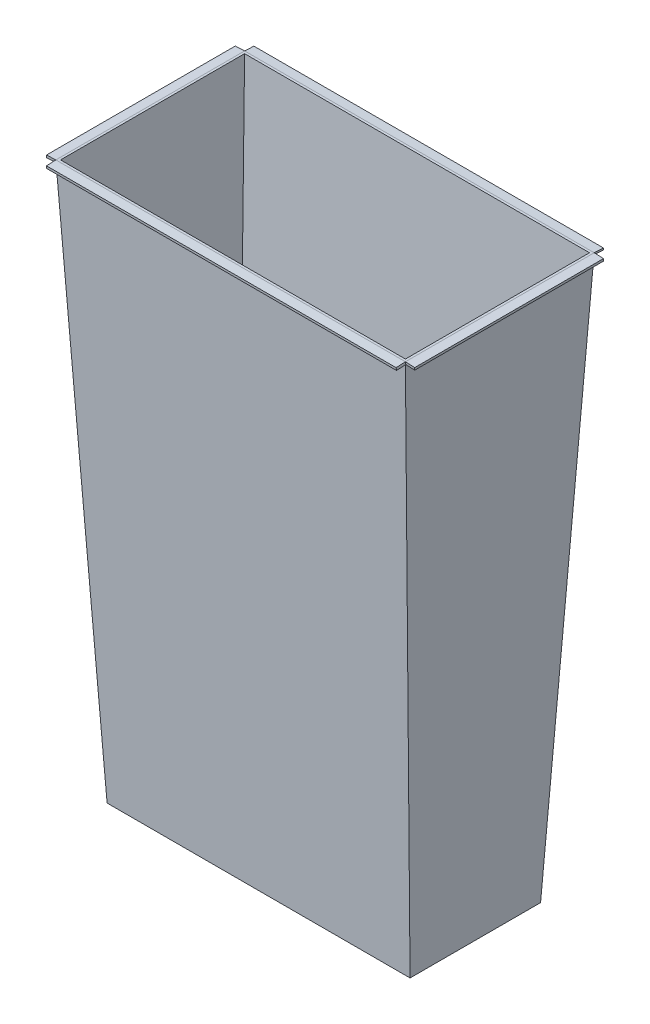
ISO-10303-21;
HEADER;
FILE_DESCRIPTION(('STEP AP214'),'2;1');
FILE_NAME('part.step','',(''),(''),'','','');
FILE_SCHEMA(('AUTOMOTIVE_DESIGN { 1 0 10303 214 1 1 1 1 }'));
ENDSEC;
DATA;
#1=APPLICATION_CONTEXT('core data for automotive mechanical design processes');
#2=APPLICATION_PROTOCOL_DEFINITION('international standard','automotive_design',2000,#1);
#3=PRODUCT_CONTEXT('',#1,'mechanical');
#4=PRODUCT('Part','Part','',(#3));
#5=PRODUCT_RELATED_PRODUCT_CATEGORY('part','',(#4));
#6=PRODUCT_DEFINITION_FORMATION('','',#4);
#7=PRODUCT_DEFINITION_CONTEXT('part definition',#1,'design');
#8=PRODUCT_DEFINITION('design','',#6,#7);
#9=PRODUCT_DEFINITION_SHAPE('','',#8);
#10=(LENGTH_UNIT() NAMED_UNIT(*) SI_UNIT(.MILLI.,.METRE.));
#11=(NAMED_UNIT(*) PLANE_ANGLE_UNIT() SI_UNIT($,.RADIAN.));
#12=(NAMED_UNIT(*) SI_UNIT($,.STERADIAN.) SOLID_ANGLE_UNIT());
#13=UNCERTAINTY_MEASURE_WITH_UNIT(LENGTH_MEASURE(1.E-05),#10,'distance_accuracy_value','');
#14=(GEOMETRIC_REPRESENTATION_CONTEXT(3) GLOBAL_UNCERTAINTY_ASSIGNED_CONTEXT((#13)) GLOBAL_UNIT_ASSIGNED_CONTEXT((#10,
#11,#12)) REPRESENTATION_CONTEXT('',''));
#15=CARTESIAN_POINT('',(0.,0.,0.));
#16=DIRECTION('',(0.,0.,1.));
#17=DIRECTION('',(1.,0.,0.));
#18=AXIS2_PLACEMENT_3D('',#15,#16,#17);
#19=CARTESIAN_POINT('',(0.,0.633416458852866,-12.6683291770573));
#20=DIRECTION('',(0.,-0.0499376169438923,0.998752338877845));
#21=DIRECTION('',(0.,-0.998752338877845,-0.0499376169438923));
#22=AXIS2_PLACEMENT_3D('',#19,#20,#21);
#23=PLANE('',#22);
#24=DIRECTION('',(-0.0415786937506803,-0.997888650016328,-0.0498944325008165));
#25=VECTOR('',#24,1.);
#26=CARTESIAN_POINT('',(488.95,0.,-12.6999999999999));
#27=LINE('',#26,#25);
#28=CARTESIAN_POINT('',(488.817873388503,-3.17103867593733,-12.8585519337968));
#29=VERTEX_POINT('',#28);
#30=CARTESIAN_POINT('',(488.817823020539,-3.17224750706824,-12.8586123753534));
#31=VERTEX_POINT('',#30);
#32=EDGE_CURVE('E477',#29,#31,#27,.T.);
#33=ORIENTED_EDGE('',*,*,#32,.F.);
#34=DIRECTION('',(1.,0.,0.));
#35=VECTOR('',#34,1.);
#36=CARTESIAN_POINT('',(489.354419625125,-3.17103867593704,-12.8585519337968));
#37=LINE('',#36,#35);
#38=CARTESIAN_POINT('',(12.8321266114974,-3.1710386759371,-12.8585519337968));
#39=VERTEX_POINT('',#38);
#40=EDGE_CURVE('E60',#39,#29,#37,.T.);
#41=ORIENTED_EDGE('',*,*,#40,.F.);
#42=DIRECTION('',(0.0415786937506803,-0.997888650016328,-0.0498944325008165));
#43=VECTOR('',#42,1.);
#44=CARTESIAN_POINT('',(12.7,0.,-12.6999999999999));
#45=LINE('',#44,#43);
#46=CARTESIAN_POINT('',(12.8321769794612,-3.17224750706822,-12.8586123753534));
#47=VERTEX_POINT('',#46);
#48=EDGE_CURVE('E481',#39,#47,#45,.T.);
#49=ORIENTED_EDGE('',*,*,#48,.T.);
#50=CARTESIAN_POINT('',(44.45,-762.,-50.8));
#51=VERTEX_POINT('',#50);
#52=EDGE_CURVE('E350',#47,#51,#45,.T.);
#53=ORIENTED_EDGE('',*,*,#52,.T.);
#54=DIRECTION('',(1.,0.,0.));
#55=VECTOR('',#54,1.);
#56=CARTESIAN_POINT('',(44.45,-762.,-50.8));
#57=LINE('',#56,#55);
#58=CARTESIAN_POINT('',(457.2,-762.,-50.8));
#59=VERTEX_POINT('',#58);
#60=EDGE_CURVE('E329',#51,#59,#57,.T.);
#61=ORIENTED_EDGE('',*,*,#60,.T.);
#62=EDGE_CURVE('E381',#31,#59,#27,.T.);
#63=ORIENTED_EDGE('',*,*,#62,.F.);
#64=EDGE_LOOP('',(#33,#41,#49,#53,#61,#63));
#65=FACE_BOUND('',#64,.T.);
#66=ADVANCED_FACE('F42',(#65),#23,.T.);
#67=CARTESIAN_POINT('',(12.6779896013865,0.528249566724436,0.));
#68=DIRECTION('',(0.999133073092352,0.0416305447121812,0.));
#69=DIRECTION('',(-0.0416305447121812,0.999133073092352,0.));
#70=AXIS2_PLACEMENT_3D('',#67,#68,#69);
#71=PLANE('',#70);
#72=ORIENTED_EDGE('',*,*,#48,.F.);
#73=DIRECTION('',(0.00208072953512228,-0.049937508842932,0.99875017685864));
#74=VECTOR('',#73,1.);
#75=CARTESIAN_POINT('',(12.8584632938224,-3.80311905173782,-0.216944417782356));
#76=LINE('',#75,#74);
#77=CARTESIAN_POINT('',(12.8321517954793,-3.1722485564008,-12.8343543245228));
#78=VERTEX_POINT('',#77);
#79=EDGE_CURVE('E216',#39,#78,#76,.T.);
#80=ORIENTED_EDGE('',*,*,#79,.T.);
#81=DIRECTION('',(0.,0.,1.));
#82=VECTOR('',#81,1.);
#83=CARTESIAN_POINT('',(12.8321769794612,-3.17224750706822,-12.6999999999999));
#84=LINE('',#83,#82);
#85=EDGE_CURVE('E483',#47,#78,#84,.T.);
#86=ORIENTED_EDGE('',*,*,#85,.F.);
#87=EDGE_LOOP('',(#72,#80,#86));
#88=FACE_BOUND('',#87,.T.);
#89=ADVANCED_FACE('F564',(#88),#71,.T.);
#90=CARTESIAN_POINT('',(0.143186951188333,-3.70095542491292,-12.6999999999999));
#91=DIRECTION('',(-0.0416305447121813,0.999133073092352,0.));
#92=DIRECTION('',(-0.999133073092352,-0.0416305447121813,0.));
#93=AXIS2_PLACEMENT_3D('',#90,#91,#92);
#94=PLANE('',#93);
#95=DIRECTION('',(0.00207454085692946,8.64392023719392E-05,-0.999997844401925));
#96=VECTOR('',#95,1.);
#97=CARTESIAN_POINT('',(12.8317932276514,-3.17226349672696,-12.6736312113128));
#98=LINE('',#97,#96);
#99=CARTESIAN_POINT('',(12.8318479308988,-3.17226121742498,-12.6999999999999));
#100=VERTEX_POINT('',#99);
#101=EDGE_CURVE('E212',#100,#78,#98,.T.);
#102=ORIENTED_EDGE('',*,*,#101,.F.);
#103=DIRECTION('',(0.999133073092352,0.0416305447121813,0.));
#104=VECTOR('',#103,1.);
#105=CARTESIAN_POINT('',(0.143186951188333,-3.70095542491292,-12.6999999999999));
#106=LINE('',#105,#104);
#107=CARTESIAN_POINT('',(0.143186951188333,-3.70095542491292,-12.6999999999999));
#108=VERTEX_POINT('',#107);
#109=EDGE_CURVE('E430',#108,#100,#106,.T.);
#110=ORIENTED_EDGE('',*,*,#109,.F.);
#111=DIRECTION('',(0.,0.,1.));
#112=VECTOR('',#111,1.);
#113=CARTESIAN_POINT('',(0.143186951188333,-3.70095542491292,-12.6999999999999));
#114=LINE('',#113,#112);
#115=CARTESIAN_POINT('',(0.143186951188303,-3.70095542491295,-269.7031699267));
#116=VERTEX_POINT('',#115);
#117=EDGE_CURVE('E535',#116,#108,#114,.T.);
#118=ORIENTED_EDGE('',*,*,#117,.F.);
#119=DIRECTION('',(0.999133073092352,0.0416305447121813,0.));
#120=VECTOR('',#119,1.);
#121=CARTESIAN_POINT('',(0.143186951188303,-3.70095542491295,-269.7031699267));
#122=LINE('',#121,#120);
#123=CARTESIAN_POINT('',(12.8321769794612,-3.17224750706825,-269.7031699267));
#124=VERTEX_POINT('',#123);
#125=EDGE_CURVE('E433',#116,#124,#122,.T.);
#126=ORIENTED_EDGE('',*,*,#125,.T.);
#127=EDGE_CURVE('E440',#124,#47,#84,.T.);
#128=ORIENTED_EDGE('',*,*,#127,.T.);
#129=ORIENTED_EDGE('',*,*,#85,.T.);
#130=EDGE_LOOP('',(#102,#110,#118,#126,#128,#129));
#131=FACE_BOUND('',#130,.T.);
#132=ADVANCED_FACE('F568',(#131),#94,.F.);
#133=CARTESIAN_POINT('',(0.0110099717271564,-0.528707917844703,-12.6999999999999));
#134=DIRECTION('',(0.,0.,-1.));
#135=DIRECTION('',(-1.,0.,0.));
#136=AXIS2_PLACEMENT_3D('',#133,#134,#135);
#137=PLANE('',#136);
#138=DIRECTION('',(0.0415269071462964,-0.999137385939923,0.));
#139=VECTOR('',#138,1.);
#140=CARTESIAN_POINT('',(12.7000547049013,-0.00131619992393332,-12.6999999999999));
#141=LINE('',#140,#139);
#142=CARTESIAN_POINT('',(12.7,0.,-12.6999999999999));
#143=VERTEX_POINT('',#142);
#144=EDGE_CURVE('E239',#143,#100,#141,.T.);
#145=ORIENTED_EDGE('',*,*,#144,.F.);
#146=DIRECTION('',(0.999133073092352,0.0416305447121813,0.));
#147=VECTOR('',#146,1.);
#148=CARTESIAN_POINT('',(0.0110099717271564,-0.528707917844703,-12.6999999999999));
#149=LINE('',#148,#147);
#150=CARTESIAN_POINT('',(0.0110099717271564,-0.528707917844703,-12.6999999999999));
#151=VERTEX_POINT('',#150);
#152=EDGE_CURVE('E427',#151,#143,#149,.T.);
#153=ORIENTED_EDGE('',*,*,#152,.F.);
#154=DIRECTION('',(-0.0416305447121816,0.999133073092352,0.));
#155=VECTOR('',#154,1.);
#156=CARTESIAN_POINT('',(0.0110099717271564,-0.528707917844703,-12.6999999999999));
#157=LINE('',#156,#155);
#158=EDGE_CURVE('E431',#108,#151,#157,.T.);
#159=ORIENTED_EDGE('',*,*,#158,.F.);
#160=ORIENTED_EDGE('',*,*,#109,.T.);
#161=EDGE_LOOP('',(#145,#153,#159,#160));
#162=FACE_BOUND('',#161,.T.);
#163=ADVANCED_FACE('F425',(#162),#137,.F.);
#164=CARTESIAN_POINT('',(501.506813048812,-3.70095542491295,-12.8586123753534));
#165=DIRECTION('',(0.00207713240311414,0.0498511776747395,-0.998754497164054));
#166=DIRECTION('',(0.,0.998756651723687,0.0498512852160176));
#167=AXIS2_PLACEMENT_3D('',#164,#165,#166);
#168=PLANE('',#167);
#169=DIRECTION('',(0.999997842758147,-0.000103727042675849,0.00207454085351943));
#170=VECTOR('',#169,1.);
#171=CARTESIAN_POINT('',(501.506813143838,-3.17235486497189,-12.8322281530997));
#172=LINE('',#171,#170);
#173=CARTESIAN_POINT('',(489.354419625125,-3.17109433041121,-12.8574388443079));
#174=VERTEX_POINT('',#173);
#175=EDGE_CURVE('E12',#29,#174,#172,.T.);
#176=ORIENTED_EDGE('',*,*,#175,.F.);
#177=ORIENTED_EDGE('',*,*,#32,.T.);
#178=DIRECTION('',(-0.999133073092352,0.0416305447121813,0.));
#179=VECTOR('',#178,1.);
#180=CARTESIAN_POINT('',(501.506813048812,-3.70095542491295,-12.8586123753534));
#181=LINE('',#180,#179);
#182=CARTESIAN_POINT('',(501.506813048812,-3.70095542491295,-12.8586123753534));
#183=VERTEX_POINT('',#182);
#184=EDGE_CURVE('E506',#183,#31,#181,.T.);
#185=ORIENTED_EDGE('',*,*,#184,.F.);
#186=DIRECTION('',(-0.0415786937506758,-0.997888650016328,-0.0498944325008163));
#187=VECTOR('',#186,1.);
#188=CARTESIAN_POINT('',(501.506813048812,-3.70095542491295,-12.8586123753534));
#189=LINE('',#188,#187);
#190=CARTESIAN_POINT('',(501.638990028273,-0.528707917844696,-12.6999999999999));
#191=VERTEX_POINT('',#190);
#192=EDGE_CURVE('E408',#191,#183,#189,.T.);
#193=ORIENTED_EDGE('',*,*,#192,.F.);
#194=DIRECTION('',(-0.999133073092352,0.0416305447121813,0.));
#195=VECTOR('',#194,1.);
#196=CARTESIAN_POINT('',(501.638990028273,-0.528707917844696,-12.6999999999999));
#197=LINE('',#196,#195);
#198=CARTESIAN_POINT('',(488.95,0.,-12.6999999999999));
#199=VERTEX_POINT('',#198);
#200=EDGE_CURVE('E387',#191,#199,#197,.T.);
#201=ORIENTED_EDGE('',*,*,#200,.T.);
#202=DIRECTION('',(-0.126355337061181,0.990764710906241,0.0491895966544649));
#203=VECTOR('',#202,1.);
#204=CARTESIAN_POINT('',(489.614780504204,-5.21260976688847,-12.9587962299503));
#205=LINE('',#204,#203);
#206=EDGE_CURVE('E213',#174,#199,#205,.T.);
#207=ORIENTED_EDGE('',*,*,#206,.F.);
#208=EDGE_LOOP('',(#176,#177,#185,#193,#201,#207));
#209=FACE_BOUND('',#208,.T.);
#210=ADVANCED_FACE('F405',(#209),#168,.F.);
#211=CARTESIAN_POINT('',(488.102599653379,-20.3376083188908,0.));
#212=DIRECTION('',(0.999133073092352,-0.0416305447121813,0.));
#213=DIRECTION('',(0.0416305447121813,0.999133073092352,0.));
#214=AXIS2_PLACEMENT_3D('',#211,#212,#213);
#215=PLANE('',#214);
#216=DIRECTION('',(-0.0415697115699519,-0.997673077678844,0.0540406250409374));
#217=VECTOR('',#216,1.);
#218=CARTESIAN_POINT('',(488.95,0.,-269.875));
#219=LINE('',#218,#217);
#220=CARTESIAN_POINT('',(488.817823020539,-3.17224750706821,-269.7031699267));
#221=VERTEX_POINT('',#220);
#222=CARTESIAN_POINT('',(457.2,-762.,-228.6));
#223=VERTEX_POINT('',#222);
#224=EDGE_CURVE('E369',#221,#223,#219,.T.);
#225=ORIENTED_EDGE('',*,*,#224,.F.);
#226=DIRECTION('',(0.,0.,-1.));
#227=VECTOR('',#226,1.);
#228=CARTESIAN_POINT('',(488.817823020539,-3.17224750706821,-269.7031699267));
#229=LINE('',#228,#227);
#230=EDGE_CURVE('E673',#31,#221,#229,.T.);
#231=ORIENTED_EDGE('',*,*,#230,.F.);
#232=ORIENTED_EDGE('',*,*,#62,.T.);
#233=DIRECTION('',(0.,0.,-1.));
#234=VECTOR('',#233,1.);
#235=CARTESIAN_POINT('',(457.2,-762.,-228.6));
#236=LINE('',#235,#234);
#237=EDGE_CURVE('E307',#59,#223,#236,.T.);
#238=ORIENTED_EDGE('',*,*,#237,.T.);
#239=EDGE_LOOP('',(#225,#231,#232,#238));
#240=FACE_BOUND('',#239,.T.);
#241=ADVANCED_FACE('F599',(#240),#215,.T.);
#242=CARTESIAN_POINT('',(0.,-14.5754643493915,-269.085495681075));
#243=DIRECTION('',(0.,-0.0540873778484507,-0.998536206432936));
#244=DIRECTION('',(0.,0.998536206432936,-0.0540873778484507));
#245=AXIS2_PLACEMENT_3D('',#242,#243,#244);
#246=PLANE('',#245);
#247=DIRECTION('',(0.0415697115699518,-0.997673077678844,0.0540406250409373));
#248=VECTOR('',#247,1.);
#249=CARTESIAN_POINT('',(12.7,0.,-269.875));
#250=LINE('',#249,#248);
#251=CARTESIAN_POINT('',(12.7,0.,-269.875));
#252=VERTEX_POINT('',#251);
#253=CARTESIAN_POINT('',(12.8035186771145,-2.48444825074771,-269.740425719751));
#254=VERTEX_POINT('',#253);
#255=EDGE_CURVE('E356',#252,#254,#250,.T.);
#256=ORIENTED_EDGE('',*,*,#255,.F.);
#257=CARTESIAN_POINT('',(-17.1490929525716,-2.48444825074732,-269.740425719751));
#258=DIRECTION('',(0.,0.0540873778484507,0.998536206432936));
#259=DIRECTION('',(0.,-0.998536206432936,0.0540873778484507));
#260=AXIS2_PLACEMENT_3D('',#257,#258,#259);
#261=CIRCLE('',#260,29.952611629686);
#262=EDGE_CURVE('E504',#254,#252,#261,.T.);
#263=ORIENTED_EDGE('',*,*,#262,.F.);
#264=EDGE_LOOP('',(#256,#263));
#265=FACE_BOUND('',#264,.T.);
#266=ADVANCED_FACE('F280',(#265),#246,.T.);
#267=EDGE_CURVE('E348',#254,#124,#250,.T.);
#268=ORIENTED_EDGE('',*,*,#267,.F.);
#269=DIRECTION('',(-1.,0.,0.));
#270=VECTOR('',#269,1.);
#271=CARTESIAN_POINT('',(488.846481322886,-2.48444825074732,-269.740425719751));
#272=LINE('',#271,#270);
#273=CARTESIAN_POINT('',(488.846481322886,-2.48444825074732,-269.740425719751));
#274=VERTEX_POINT('',#273);
#275=EDGE_CURVE('E505',#274,#254,#272,.T.);
#276=ORIENTED_EDGE('',*,*,#275,.F.);
#277=EDGE_CURVE('E365',#274,#221,#219,.T.);
#278=ORIENTED_EDGE('',*,*,#277,.T.);
#279=ORIENTED_EDGE('',*,*,#224,.T.);
#280=DIRECTION('',(-1.,0.,0.));
#281=VECTOR('',#280,1.);
#282=CARTESIAN_POINT('',(44.45,-762.,-228.6));
#283=LINE('',#282,#281);
#284=CARTESIAN_POINT('',(44.45,-762.,-228.6));
#285=VERTEX_POINT('',#284);
#286=EDGE_CURVE('E53',#223,#285,#283,.T.);
#287=ORIENTED_EDGE('',*,*,#286,.T.);
#288=EDGE_CURVE('E340',#124,#285,#250,.T.);
#289=ORIENTED_EDGE('',*,*,#288,.F.);
#290=EDGE_LOOP('',(#268,#276,#278,#279,#287,#289));
#291=FACE_BOUND('',#290,.T.);
#292=ADVANCED_FACE('F632',(#291),#246,.T.);
#293=CARTESIAN_POINT('',(0.,-762.,0.));
#294=DIRECTION('',(0.,1.,0.));
#295=DIRECTION('',(0.,0.,1.));
#296=AXIS2_PLACEMENT_3D('',#293,#294,#295);
#297=PLANE('',#296);
#298=DIRECTION('',(0.,0.,1.));
#299=VECTOR('',#298,1.);
#300=CARTESIAN_POINT('',(44.45,-762.,-228.6));
#301=LINE('',#300,#299);
#302=EDGE_CURVE('E301',#285,#51,#301,.T.);
#303=ORIENTED_EDGE('',*,*,#302,.F.);
#304=ORIENTED_EDGE('',*,*,#286,.F.);
#305=ORIENTED_EDGE('',*,*,#237,.F.);
#306=ORIENTED_EDGE('',*,*,#60,.F.);
#307=EDGE_LOOP('',(#303,#304,#305,#306));
#308=FACE_BOUND('',#307,.T.);
#309=ADVANCED_FACE('F44',(#308),#297,.F.);
#310=CARTESIAN_POINT('',(0.,0.,0.));
#311=DIRECTION('',(0.,1.,0.));
#312=DIRECTION('',(0.,0.,1.));
#313=AXIS2_PLACEMENT_3D('',#310,#311,#312);
#314=PLANE('',#313);
#315=DIRECTION('',(-1.,0.,0.));
#316=VECTOR('',#315,1.);
#317=CARTESIAN_POINT('',(0.,0.,-266.695345642406));
#318=LINE('',#317,#316);
#319=CARTESIAN_POINT('',(485.772245118787,0.,-266.695345642406));
#320=VERTEX_POINT('',#319);
#321=CARTESIAN_POINT('',(15.8777548812124,0.,-266.695345642406));
#322=VERTEX_POINT('',#321);
#323=EDGE_CURVE('E436',#320,#322,#318,.T.);
#324=ORIENTED_EDGE('',*,*,#323,.F.);
#325=DIRECTION('',(0.,0.,-1.));
#326=VECTOR('',#325,1.);
#327=CARTESIAN_POINT('',(485.772245118787,0.,0.));
#328=LINE('',#327,#326);
#329=CARTESIAN_POINT('',(485.772245118787,0.,-15.8789662726269));
#330=VERTEX_POINT('',#329);
#331=EDGE_CURVE('E460',#330,#320,#328,.T.);
#332=ORIENTED_EDGE('',*,*,#331,.F.);
#333=DIRECTION('',(1.,0.,0.));
#334=VECTOR('',#333,1.);
#335=CARTESIAN_POINT('',(0.,0.,-15.8789662726269));
#336=LINE('',#335,#334);
#337=CARTESIAN_POINT('',(15.8777548812125,0.,-15.8789662726269));
#338=VERTEX_POINT('',#337);
#339=EDGE_CURVE('E472',#338,#330,#336,.T.);
#340=ORIENTED_EDGE('',*,*,#339,.F.);
#341=DIRECTION('',(0.,0.,1.));
#342=VECTOR('',#341,1.);
#343=CARTESIAN_POINT('',(15.8777548812125,0.,0.));
#344=LINE('',#343,#342);
#345=EDGE_CURVE('E469',#322,#338,#344,.T.);
#346=ORIENTED_EDGE('',*,*,#345,.F.);
#347=EDGE_LOOP('',(#324,#332,#340,#346));
#348=FACE_BOUND('',#347,.T.);
#349=DIRECTION('',(-1.,0.,0.));
#350=VECTOR('',#349,1.);
#351=CARTESIAN_POINT('',(488.95,0.,-269.875));
#352=LINE('',#351,#350);
#353=CARTESIAN_POINT('',(488.95,0.,-269.875));
#354=VERTEX_POINT('',#353);
#355=EDGE_CURVE('E248',#354,#252,#352,.T.);
#356=ORIENTED_EDGE('',*,*,#355,.T.);
#357=DIRECTION('',(0.,0.,1.));
#358=VECTOR('',#357,1.);
#359=CARTESIAN_POINT('',(12.7,0.,-269.875));
#360=LINE('',#359,#358);
#361=EDGE_CURVE('E243',#252,#143,#360,.T.);
#362=ORIENTED_EDGE('',*,*,#361,.T.);
#363=DIRECTION('',(1.,0.,0.));
#364=VECTOR('',#363,1.);
#365=CARTESIAN_POINT('',(12.7,0.,-12.6999999999999));
#366=LINE('',#365,#364);
#367=EDGE_CURVE('E247',#143,#199,#366,.T.);
#368=ORIENTED_EDGE('',*,*,#367,.T.);
#369=DIRECTION('',(0.,0.,-1.));
#370=VECTOR('',#369,1.);
#371=CARTESIAN_POINT('',(488.95,0.,-12.6999999999999));
#372=LINE('',#371,#370);
#373=EDGE_CURVE('E231',#199,#354,#372,.T.);
#374=ORIENTED_EDGE('',*,*,#373,.T.);
#375=EDGE_LOOP('',(#356,#362,#368,#374));
#376=FACE_BOUND('',#375,.T.);
#377=ADVANCED_FACE('F266',(#348,#376),#314,.T.);
#378=CARTESIAN_POINT('',(12.6779896013865,0.528249566724438,0.));
#379=DIRECTION('',(-0.999133073092352,-0.0416305447121813,0.));
#380=DIRECTION('',(0.0416305447121813,-0.999133073092352,0.));
#381=AXIS2_PLACEMENT_3D('',#378,#379,#380);
#382=PLANE('',#381);
#383=ORIENTED_EDGE('',*,*,#127,.F.);
#384=ORIENTED_EDGE('',*,*,#288,.T.);
#385=ORIENTED_EDGE('',*,*,#302,.T.);
#386=ORIENTED_EDGE('',*,*,#52,.F.);
#387=EDGE_LOOP('',(#383,#384,#385,#386));
#388=FACE_BOUND('',#387,.T.);
#389=ADVANCED_FACE('F276',(#388),#382,.T.);
#390=CARTESIAN_POINT('',(0.,-758.825,0.));
#391=DIRECTION('',(0.,1.,0.));
#392=DIRECTION('',(0.,0.,1.));
#393=AXIS2_PLACEMENT_3D('',#390,#391,#392);
#394=PLANE('',#393);
#395=DIRECTION('',(0.,0.,1.));
#396=VECTOR('',#395,1.);
#397=CARTESIAN_POINT('',(47.4954632145458,-758.825,0.));
#398=LINE('',#397,#396);
#399=CARTESIAN_POINT('',(47.4954632145458,-758.825,-225.592324809072));
#400=VERTEX_POINT('',#399);
#401=CARTESIAN_POINT('',(47.4954632145458,-758.825,-53.820216272627));
#402=VERTEX_POINT('',#401);
#403=EDGE_CURVE('E444',#400,#402,#398,.T.);
#404=ORIENTED_EDGE('',*,*,#403,.T.);
#405=DIRECTION('',(1.,0.,0.));
#406=VECTOR('',#405,1.);
#407=CARTESIAN_POINT('',(0.,-758.825,-53.820216272627));
#408=LINE('',#407,#406);
#409=CARTESIAN_POINT('',(454.154536785454,-758.825,-53.820216272627));
#410=VERTEX_POINT('',#409);
#411=EDGE_CURVE('E447',#402,#410,#408,.T.);
#412=ORIENTED_EDGE('',*,*,#411,.T.);
#413=DIRECTION('',(0.,0.,-1.));
#414=VECTOR('',#413,1.);
#415=CARTESIAN_POINT('',(454.154536785454,-758.825,0.));
#416=LINE('',#415,#414);
#417=CARTESIAN_POINT('',(454.154536785454,-758.825,-225.592324809072));
#418=VERTEX_POINT('',#417);
#419=EDGE_CURVE('E451',#410,#418,#416,.T.);
#420=ORIENTED_EDGE('',*,*,#419,.T.);
#421=DIRECTION('',(-1.,0.,0.));
#422=VECTOR('',#421,1.);
#423=CARTESIAN_POINT('',(0.,-758.825,-225.592324809072));
#424=LINE('',#423,#422);
#425=EDGE_CURVE('E391',#418,#400,#424,.T.);
#426=ORIENTED_EDGE('',*,*,#425,.T.);
#427=EDGE_LOOP('',(#404,#412,#420,#426));
#428=FACE_BOUND('',#427,.T.);
#429=ADVANCED_FACE('F573',(#428),#394,.T.);
#430=CARTESIAN_POINT('',(0.,-14.4037369247227,-265.91514322565));
#431=DIRECTION('',(0.,-0.0540873778484507,-0.998536206432936));
#432=DIRECTION('',(0.,0.998536206432936,-0.0540873778484507));
#433=AXIS2_PLACEMENT_3D('',#430,#431,#432);
#434=PLANE('',#433);
#435=DIRECTION('',(-0.0415697115699518,-0.997673077678844,0.0540406250409374));
#436=VECTOR('',#435,1.);
#437=CARTESIAN_POINT('',(484.333692189838,-34.5252702947933,-264.825226834771));
#438=LINE('',#437,#436);
#439=EDGE_CURVE('E456',#320,#418,#438,.T.);
#440=ORIENTED_EDGE('',*,*,#439,.F.);
#441=ORIENTED_EDGE('',*,*,#323,.T.);
#442=DIRECTION('',(0.0415697115699518,-0.997673077678844,0.0540406250409374));
#443=VECTOR('',#442,1.);
#444=CARTESIAN_POINT('',(16.4494360826396,-13.7203488342532,-265.95216008055));
#445=LINE('',#444,#443);
#446=EDGE_CURVE('E459',#322,#400,#445,.T.);
#447=ORIENTED_EDGE('',*,*,#446,.T.);
#448=ORIENTED_EDGE('',*,*,#425,.F.);
#449=EDGE_LOOP('',(#440,#441,#447,#448));
#450=FACE_BOUND('',#449,.T.);
#451=ADVANCED_FACE('F576',(#450),#434,.F.);
#452=CARTESIAN_POINT('',(15.8502371084547,0.660426546185613,0.));
#453=DIRECTION('',(-0.999133073092352,-0.0416305447121813,0.));
#454=DIRECTION('',(0.0416305447121813,-0.999133073092352,0.));
#455=AXIS2_PLACEMENT_3D('',#452,#453,#454);
#456=PLANE('',#455);
#457=ORIENTED_EDGE('',*,*,#446,.F.);
#458=ORIENTED_EDGE('',*,*,#345,.T.);
#459=DIRECTION('',(0.0415786937506803,-0.997888650016328,-0.0498944325008165));
#460=VECTOR('',#459,1.);
#461=CARTESIAN_POINT('',(15.8173639773877,1.44938169179302,-15.8064971880373));
#462=LINE('',#461,#460);
#463=EDGE_CURVE('E448',#338,#402,#462,.T.);
#464=ORIENTED_EDGE('',*,*,#463,.T.);
#465=ORIENTED_EDGE('',*,*,#403,.F.);
#466=EDGE_LOOP('',(#457,#458,#464,#465));
#467=FACE_BOUND('',#466,.T.);
#468=ADVANCED_FACE('F580',(#467),#456,.F.);
#469=CARTESIAN_POINT('',(484.930352146311,-20.2054313394296,0.));
#470=DIRECTION('',(0.999133073092352,-0.0416305447121813,0.));
#471=DIRECTION('',(0.0416305447121813,0.999133073092352,0.));
#472=AXIS2_PLACEMENT_3D('',#469,#470,#471);
#473=PLANE('',#472);
#474=DIRECTION('',(-0.0415786937506803,-0.997888650016328,-0.0498944325008165));
#475=VECTOR('',#474,1.);
#476=CARTESIAN_POINT('',(484.965389635779,-19.3645315922122,-16.8471928522375));
#477=LINE('',#476,#475);
#478=EDGE_CURVE('E462',#330,#410,#477,.T.);
#479=ORIENTED_EDGE('',*,*,#478,.F.);
#480=ORIENTED_EDGE('',*,*,#331,.T.);
#481=ORIENTED_EDGE('',*,*,#439,.T.);
#482=ORIENTED_EDGE('',*,*,#419,.F.);
#483=EDGE_LOOP('',(#479,#480,#481,#482));
#484=FACE_BOUND('',#483,.T.);
#485=ADVANCED_FACE('F583',(#484),#473,.F.);
#486=CARTESIAN_POINT('',(0.,0.791968392649724,-15.8393678529945));
#487=DIRECTION('',(0.,-0.0499376169438923,0.998752338877845));
#488=DIRECTION('',(0.,-0.998752338877845,-0.0499376169438923));
#489=AXIS2_PLACEMENT_3D('',#486,#487,#488);
#490=PLANE('',#489);
#491=ORIENTED_EDGE('',*,*,#463,.F.);
#492=ORIENTED_EDGE('',*,*,#339,.T.);
#493=ORIENTED_EDGE('',*,*,#478,.T.);
#494=ORIENTED_EDGE('',*,*,#411,.F.);
#495=EDGE_LOOP('',(#491,#492,#493,#494));
#496=FACE_BOUND('',#495,.T.);
#497=ADVANCED_FACE('F278',(#496),#490,.F.);
#498=CARTESIAN_POINT('',(0.0110099717271269,-0.528707917844703,-269.875));
#499=DIRECTION('',(-0.00224974065704068,0.0539937757689791,0.998538737778953));
#500=DIRECTION('',(0.,-0.99854126475709,0.053993912409738));
#501=AXIS2_PLACEMENT_3D('',#498,#499,#500);
#502=PLANE('',#501);
#503=ORIENTED_EDGE('',*,*,#255,.T.);
#504=ORIENTED_EDGE('',*,*,#267,.T.);
#505=ORIENTED_EDGE('',*,*,#125,.F.);
#506=DIRECTION('',(0.0415697115699517,-0.997673077678844,0.0540406250409333));
#507=VECTOR('',#506,1.);
#508=CARTESIAN_POINT('',(0.0110099717271269,-0.528707917844703,-269.875));
#509=LINE('',#508,#507);
#510=CARTESIAN_POINT('',(0.0110099717271269,-0.528707917844703,-269.875));
#511=VERTEX_POINT('',#510);
#512=EDGE_CURVE('E488',#511,#116,#509,.T.);
#513=ORIENTED_EDGE('',*,*,#512,.F.);
#514=DIRECTION('',(0.999133073092352,0.0416305447121813,0.));
#515=VECTOR('',#514,1.);
#516=CARTESIAN_POINT('',(0.0110099717271269,-0.528707917844703,-269.875));
#517=LINE('',#516,#515);
#518=EDGE_CURVE('E438',#511,#252,#517,.T.);
#519=ORIENTED_EDGE('',*,*,#518,.T.);
#520=EDGE_LOOP('',(#503,#504,#505,#513,#519));
#521=FACE_BOUND('',#520,.T.);
#522=ADVANCED_FACE('F563',(#521),#502,.F.);
#523=CARTESIAN_POINT('',(0.0110099717271269,-0.528707917844703,-269.875));
#524=DIRECTION('',(0.0416305447121813,-0.999133073092352,0.));
#525=DIRECTION('',(0.999133073092352,0.0416305447121813,0.));
#526=AXIS2_PLACEMENT_3D('',#523,#524,#525);
#527=PLANE('',#526);
#528=ORIENTED_EDGE('',*,*,#361,.F.);
#529=ORIENTED_EDGE('',*,*,#518,.F.);
#530=DIRECTION('',(0.,0.,-1.));
#531=VECTOR('',#530,1.);
#532=CARTESIAN_POINT('',(0.0110099717271269,-0.528707917844703,-269.875));
#533=LINE('',#532,#531);
#534=EDGE_CURVE('E537',#151,#511,#533,.T.);
#535=ORIENTED_EDGE('',*,*,#534,.F.);
#536=ORIENTED_EDGE('',*,*,#152,.T.);
#537=EDGE_LOOP('',(#528,#529,#535,#536));
#538=FACE_BOUND('',#537,.T.);
#539=ADVANCED_FACE('F552',(#538),#527,.F.);
#540=CARTESIAN_POINT('',(-0.0110004268863619,-0.00045835112026714,0.));
#541=DIRECTION('',(0.999133073092352,0.0416305447121812,0.));
#542=DIRECTION('',(-0.0416305447121812,0.999133073092352,0.));
#543=AXIS2_PLACEMENT_3D('',#540,#541,#542);
#544=PLANE('',#543);
#545=ORIENTED_EDGE('',*,*,#512,.T.);
#546=ORIENTED_EDGE('',*,*,#117,.T.);
#547=ORIENTED_EDGE('',*,*,#158,.T.);
#548=ORIENTED_EDGE('',*,*,#534,.T.);
#549=EDGE_LOOP('',(#545,#546,#547,#548));
#550=FACE_BOUND('',#549,.T.);
#551=ADVANCED_FACE('F562',(#550),#544,.F.);
#552=CARTESIAN_POINT('',(-17.1490929525716,-3.17135794942264,-282.421835541449));
#553=DIRECTION('',(0.,0.0540873778484507,0.998536206432936));
#554=DIRECTION('',(0.,-0.998536206432936,0.0540873778484507));
#555=AXIS2_PLACEMENT_3D('',#552,#553,#554);
#556=CYLINDRICAL_SURFACE('',#555,29.952611629686);
#557=ORIENTED_EDGE('',*,*,#262,.T.);
#558=DIRECTION('',(0.,0.0540873778484507,0.998536206432936));
#559=VECTOR('',#558,1.);
#560=CARTESIAN_POINT('',(12.7,-0.686909698675327,-282.556409821698));
#561=LINE('',#560,#559);
#562=CARTESIAN_POINT('',(12.7,-0.686909698675327,-282.556409821698));
#563=VERTEX_POINT('',#562);
#564=EDGE_CURVE('E484',#563,#252,#561,.T.);
#565=ORIENTED_EDGE('',*,*,#564,.F.);
#566=CARTESIAN_POINT('',(-17.1490929525716,-3.17135794942264,-282.421835541449));
#567=DIRECTION('',(0.,0.0540873778484507,0.998536206432936));
#568=DIRECTION('',(0.,-0.998536206432936,0.0540873778484507));
#569=AXIS2_PLACEMENT_3D('',#566,#567,#568);
#570=CIRCLE('',#569,29.952611629686);
#571=CARTESIAN_POINT('',(12.8035186771145,-3.17135794942264,-282.421835541449));
#572=VERTEX_POINT('',#571);
#573=EDGE_CURVE('E511',#572,#563,#570,.T.);
#574=ORIENTED_EDGE('',*,*,#573,.F.);
#575=DIRECTION('',(0.,0.0540873778484507,0.998536206432936));
#576=VECTOR('',#575,1.);
#577=CARTESIAN_POINT('',(12.8035186771145,-3.17135794942264,-282.421835541449));
#578=LINE('',#577,#576);
#579=EDGE_CURVE('E528',#572,#254,#578,.T.);
#580=ORIENTED_EDGE('',*,*,#579,.T.);
#581=EDGE_LOOP('',(#557,#565,#574,#580));
#582=FACE_BOUND('',#581,.T.);
#583=ADVANCED_FACE('F643',(#582),#556,.F.);
#584=CARTESIAN_POINT('',(12.7,-0.686909698675327,-282.556409821698));
#585=DIRECTION('',(0.,-0.998536206432936,0.0540873778484507));
#586=DIRECTION('',(0.,-0.0540873778484507,-0.998536206432936));
#587=AXIS2_PLACEMENT_3D('',#584,#585,#586);
#588=PLANE('',#587);
#589=ORIENTED_EDGE('',*,*,#355,.F.);
#590=DIRECTION('',(0.,0.0540873778484507,0.998536206432936));
#591=VECTOR('',#590,1.);
#592=CARTESIAN_POINT('',(488.95,-0.686909698675324,-282.556409821698));
#593=LINE('',#592,#591);
#594=CARTESIAN_POINT('',(488.95,-0.686909698675324,-282.556409821698));
#595=VERTEX_POINT('',#594);
#596=EDGE_CURVE('E370',#595,#354,#593,.T.);
#597=ORIENTED_EDGE('',*,*,#596,.F.);
#598=DIRECTION('',(1.,0.,0.));
#599=VECTOR('',#598,1.);
#600=CARTESIAN_POINT('',(12.7,-0.686909698675327,-282.556409821698));
#601=LINE('',#600,#599);
#602=EDGE_CURVE('E523',#563,#595,#601,.T.);
#603=ORIENTED_EDGE('',*,*,#602,.F.);
#604=ORIENTED_EDGE('',*,*,#564,.T.);
#605=EDGE_LOOP('',(#589,#597,#603,#604));
#606=FACE_BOUND('',#605,.T.);
#607=ADVANCED_FACE('F720',(#606),#588,.F.);
#608=CARTESIAN_POINT('',(488.95,-0.686909698675324,-282.556409821698));
#609=DIRECTION('',(-0.99913560595146,0.0415088620935602,-0.00224839669673451));
#610=DIRECTION('',(-0.0415089670135781,-0.999138131420008,0.));
#611=AXIS2_PLACEMENT_3D('',#608,#609,#610);
#612=PLANE('',#611);
#613=EDGE_CURVE('E349',#354,#274,#219,.T.);
#614=ORIENTED_EDGE('',*,*,#613,.T.);
#615=DIRECTION('',(0.,0.0540873778484507,0.998536206432936));
#616=VECTOR('',#615,1.);
#617=CARTESIAN_POINT('',(488.846481322886,-3.17135794942264,-282.421835541449));
#618=LINE('',#617,#616);
#619=CARTESIAN_POINT('',(488.846481322886,-3.17135794942264,-282.421835541449));
#620=VERTEX_POINT('',#619);
#621=EDGE_CURVE('E495',#620,#274,#618,.T.);
#622=ORIENTED_EDGE('',*,*,#621,.F.);
#623=DIRECTION('',(-0.041569711569941,-0.997673077678844,0.0540406250409411));
#624=VECTOR('',#623,1.);
#625=CARTESIAN_POINT('',(488.95,-0.686909698675324,-282.556409821698));
#626=LINE('',#625,#624);
#627=EDGE_CURVE('E525',#595,#620,#626,.T.);
#628=ORIENTED_EDGE('',*,*,#627,.F.);
#629=ORIENTED_EDGE('',*,*,#596,.T.);
#630=EDGE_LOOP('',(#614,#622,#628,#629));
#631=FACE_BOUND('',#630,.T.);
#632=ADVANCED_FACE('F649',(#631),#612,.F.);
#633=CARTESIAN_POINT('',(488.846481322886,-3.17135794942264,-282.421835541449));
#634=DIRECTION('',(0.,0.998536206432936,-0.0540873778484507));
#635=DIRECTION('',(0.,0.0540873778484507,0.998536206432936));
#636=AXIS2_PLACEMENT_3D('',#633,#634,#635);
#637=PLANE('',#636);
#638=ORIENTED_EDGE('',*,*,#275,.T.);
#639=ORIENTED_EDGE('',*,*,#579,.F.);
#640=DIRECTION('',(-1.,0.,0.));
#641=VECTOR('',#640,1.);
#642=CARTESIAN_POINT('',(488.846481322886,-3.17135794942264,-282.421835541449));
#643=LINE('',#642,#641);
#644=EDGE_CURVE('E527',#620,#572,#643,.T.);
#645=ORIENTED_EDGE('',*,*,#644,.F.);
#646=ORIENTED_EDGE('',*,*,#621,.T.);
#647=EDGE_LOOP('',(#638,#639,#645,#646));
#648=FACE_BOUND('',#647,.T.);
#649=ADVANCED_FACE('F638',(#648),#637,.F.);
#650=CARTESIAN_POINT('',(-17.1490929525716,-3.17135794942264,-282.421835541449));
#651=DIRECTION('',(0.,0.0540873778484507,0.998536206432936));
#652=DIRECTION('',(0.,-0.998536206432936,0.0540873778484507));
#653=AXIS2_PLACEMENT_3D('',#650,#651,#652);
#654=PLANE('',#653);
#655=ORIENTED_EDGE('',*,*,#573,.T.);
#656=ORIENTED_EDGE('',*,*,#602,.T.);
#657=ORIENTED_EDGE('',*,*,#627,.T.);
#658=ORIENTED_EDGE('',*,*,#644,.T.);
#659=EDGE_LOOP('',(#655,#656,#657,#658));
#660=FACE_BOUND('',#659,.T.);
#661=ADVANCED_FACE('F645',(#660),#654,.F.);
#662=CARTESIAN_POINT('',(501.506813048812,-3.70095542491292,-269.7031699267));
#663=DIRECTION('',(0.0416305447121813,0.999133073092352,0.));
#664=DIRECTION('',(-0.999133073092352,0.0416305447121813,0.));
#665=AXIS2_PLACEMENT_3D('',#662,#663,#664);
#666=PLANE('',#665);
#667=ORIENTED_EDGE('',*,*,#230,.T.);
#668=DIRECTION('',(-0.999133073092352,0.0416305447121813,0.));
#669=VECTOR('',#668,1.);
#670=CARTESIAN_POINT('',(501.506813048812,-3.70095542491292,-269.7031699267));
#671=LINE('',#670,#669);
#672=CARTESIAN_POINT('',(501.506813048812,-3.70095542491292,-269.7031699267));
#673=VERTEX_POINT('',#672);
#674=EDGE_CURVE('E386',#673,#221,#671,.T.);
#675=ORIENTED_EDGE('',*,*,#674,.F.);
#676=DIRECTION('',(0.,0.,-1.));
#677=VECTOR('',#676,1.);
#678=CARTESIAN_POINT('',(501.506813048812,-3.70095542491292,-269.7031699267));
#679=LINE('',#678,#677);
#680=EDGE_CURVE('E924',#183,#673,#679,.T.);
#681=ORIENTED_EDGE('',*,*,#680,.F.);
#682=ORIENTED_EDGE('',*,*,#184,.T.);
#683=EDGE_LOOP('',(#667,#675,#681,#682));
#684=FACE_BOUND('',#683,.T.);
#685=ADVANCED_FACE('F710',(#684),#666,.F.);
#686=CARTESIAN_POINT('',(501.638990028273,-0.528707917844696,-269.875));
#687=DIRECTION('',(0.00224974065704227,0.0539937757690144,0.998538737778951));
#688=DIRECTION('',(0.,-0.998541264757088,0.0539939124097733));
#689=AXIS2_PLACEMENT_3D('',#686,#687,#688);
#690=PLANE('',#689);
#691=ORIENTED_EDGE('',*,*,#277,.F.);
#692=ORIENTED_EDGE('',*,*,#613,.F.);
#693=DIRECTION('',(-0.999133073092352,0.0416305447121813,0.));
#694=VECTOR('',#693,1.);
#695=CARTESIAN_POINT('',(501.638990028273,-0.528707917844696,-269.875));
#696=LINE('',#695,#694);
#697=CARTESIAN_POINT('',(501.638990028273,-0.528707917844696,-269.875));
#698=VERTEX_POINT('',#697);
#699=EDGE_CURVE('E383',#698,#354,#696,.T.);
#700=ORIENTED_EDGE('',*,*,#699,.F.);
#701=DIRECTION('',(0.0415697115699476,0.997673077678842,-0.0540406250409686));
#702=VECTOR('',#701,1.);
#703=CARTESIAN_POINT('',(501.638990028273,-0.528707917844696,-269.875));
#704=LINE('',#703,#702);
#705=EDGE_CURVE('E927',#673,#698,#704,.T.);
#706=ORIENTED_EDGE('',*,*,#705,.F.);
#707=ORIENTED_EDGE('',*,*,#674,.T.);
#708=EDGE_LOOP('',(#691,#692,#700,#706,#707));
#709=FACE_BOUND('',#708,.T.);
#710=ADVANCED_FACE('F651',(#709),#690,.F.);
#711=CARTESIAN_POINT('',(501.638990028273,-0.528707917844696,-12.6999999999999));
#712=DIRECTION('',(-0.0416305447121813,-0.999133073092352,0.));
#713=DIRECTION('',(0.999133073092352,-0.0416305447121813,0.));
#714=AXIS2_PLACEMENT_3D('',#711,#712,#713);
#715=PLANE('',#714);
#716=ORIENTED_EDGE('',*,*,#373,.F.);
#717=ORIENTED_EDGE('',*,*,#200,.F.);
#718=DIRECTION('',(0.,0.,1.));
#719=VECTOR('',#718,1.);
#720=CARTESIAN_POINT('',(501.638990028273,-0.528707917844696,-12.6999999999999));
#721=LINE('',#720,#719);
#722=EDGE_CURVE('E411',#698,#191,#721,.T.);
#723=ORIENTED_EDGE('',*,*,#722,.F.);
#724=ORIENTED_EDGE('',*,*,#699,.T.);
#725=EDGE_LOOP('',(#716,#717,#723,#724));
#726=FACE_BOUND('',#725,.T.);
#727=ADVANCED_FACE('F413',(#726),#715,.F.);
#728=CARTESIAN_POINT('',(500.791589681653,-20.8663162367333,0.));
#729=DIRECTION('',(-0.999133073092352,0.0416305447121768,0.));
#730=DIRECTION('',(-0.0416305447121768,-0.999133073092352,0.));
#731=AXIS2_PLACEMENT_3D('',#728,#729,#730);
#732=PLANE('',#731);
#733=ORIENTED_EDGE('',*,*,#192,.T.);
#734=ORIENTED_EDGE('',*,*,#680,.T.);
#735=ORIENTED_EDGE('',*,*,#705,.T.);
#736=ORIENTED_EDGE('',*,*,#722,.T.);
#737=EDGE_LOOP('',(#733,#734,#735,#736));
#738=FACE_BOUND('',#737,.T.);
#739=ADVANCED_FACE('F694',(#738),#732,.F.);
#740=CARTESIAN_POINT('',(12.8321266114974,-3.80524641112453,-0.174397230048175));
#741=DIRECTION('',(0.999135232201321,0.0415268176309763,0.00207634088154882));
#742=DIRECTION('',(-0.0415269071462964,0.999137385939923,0.));
#743=AXIS2_PLACEMENT_3D('',#740,#741,#742);
#744=PLANE('',#743);
#745=ORIENTED_EDGE('',*,*,#144,.T.);
#746=ORIENTED_EDGE('',*,*,#101,.T.);
#747=DIRECTION('',(0.,0.0499376169438923,-0.998752338877845));
#748=VECTOR('',#747,1.);
#749=CARTESIAN_POINT('',(12.8321266114974,-3.80524641112453,-0.174397230048175));
#750=LINE('',#749,#748);
#751=CARTESIAN_POINT('',(12.8321266114974,-3.80524641112453,-0.174397230048175));
#752=VERTEX_POINT('',#751);
#753=EDGE_CURVE('E193',#752,#78,#750,.T.);
#754=ORIENTED_EDGE('',*,*,#753,.F.);
#755=DIRECTION('',(0.041578693750679,-0.997888650016328,-0.0498944325008161));
#756=VECTOR('',#755,1.);
#757=CARTESIAN_POINT('',(12.8321266114974,-3.80524641112453,-0.174397230048175));
#758=LINE('',#757,#756);
#759=CARTESIAN_POINT('',(12.7,-0.634207735187432,-0.0158452962513208));
#760=VERTEX_POINT('',#759);
#761=EDGE_CURVE('E199',#760,#752,#758,.T.);
#762=ORIENTED_EDGE('',*,*,#761,.F.);
#763=DIRECTION('',(0.,0.0499376169438923,-0.998752338877845));
#764=VECTOR('',#763,1.);
#765=CARTESIAN_POINT('',(12.7,-0.634207735187432,-0.0158452962513208));
#766=LINE('',#765,#764);
#767=EDGE_CURVE('E236',#760,#143,#766,.T.);
#768=ORIENTED_EDGE('',*,*,#767,.T.);
#769=EDGE_LOOP('',(#745,#746,#754,#762,#768));
#770=FACE_BOUND('',#769,.T.);
#771=ADVANCED_FACE('F211',(#770),#744,.F.);
#772=CARTESIAN_POINT('',(489.354419625125,-3.80524641112447,-0.174397230048173));
#773=DIRECTION('',(0.,0.998752338877845,0.0499376169438923));
#774=DIRECTION('',(0.,-0.0499376169438923,0.998752338877845));
#775=AXIS2_PLACEMENT_3D('',#772,#773,#774);
#776=PLANE('',#775);
#777=ORIENTED_EDGE('',*,*,#79,.F.);
#778=ORIENTED_EDGE('',*,*,#40,.T.);
#779=ORIENTED_EDGE('',*,*,#175,.T.);
#780=DIRECTION('',(0.,0.0499376169438923,-0.998752338877845));
#781=VECTOR('',#780,1.);
#782=CARTESIAN_POINT('',(489.354419625125,-3.80524641112447,-0.174397230048173));
#783=LINE('',#782,#781);
#784=CARTESIAN_POINT('',(489.354419625125,-3.80524641112447,-0.174397230048173));
#785=VERTEX_POINT('',#784);
#786=EDGE_CURVE('E195',#785,#174,#783,.T.);
#787=ORIENTED_EDGE('',*,*,#786,.F.);
#788=DIRECTION('',(1.,0.,0.));
#789=VECTOR('',#788,1.);
#790=CARTESIAN_POINT('',(489.354419625125,-3.80524641112447,-0.174397230048173));
#791=LINE('',#790,#789);
#792=EDGE_CURVE('E188',#752,#785,#791,.T.);
#793=ORIENTED_EDGE('',*,*,#792,.F.);
#794=ORIENTED_EDGE('',*,*,#753,.T.);
#795=EDGE_LOOP('',(#777,#778,#779,#787,#793,#794));
#796=FACE_BOUND('',#795,.T.);
#797=ADVANCED_FACE('F191',(#796),#776,.F.);
#798=CARTESIAN_POINT('',(488.95,-0.634207735187435,-0.0158452962513208));
#799=DIRECTION('',(-0.991985043667686,-0.126197696070034,-0.00630988480350169));
#800=DIRECTION('',(0.126200208403367,-0.992004792024185,0.));
#801=AXIS2_PLACEMENT_3D('',#798,#799,#800);
#802=PLANE('',#801);
#803=ORIENTED_EDGE('',*,*,#786,.T.);
#804=ORIENTED_EDGE('',*,*,#206,.T.);
#805=DIRECTION('',(0.,0.0499376169438923,-0.998752338877845));
#806=VECTOR('',#805,1.);
#807=CARTESIAN_POINT('',(488.95,-0.634207735187435,-0.0158452962513208));
#808=LINE('',#807,#806);
#809=CARTESIAN_POINT('',(488.95,-0.634207735187435,-0.0158452962513208));
#810=VERTEX_POINT('',#809);
#811=EDGE_CURVE('E218',#810,#199,#808,.T.);
#812=ORIENTED_EDGE('',*,*,#811,.F.);
#813=DIRECTION('',(-0.126355344721219,0.990747382494943,0.0495373691247472));
#814=VECTOR('',#813,1.);
#815=CARTESIAN_POINT('',(488.95,-0.634207735187435,-0.0158452962513208));
#816=LINE('',#815,#814);
#817=EDGE_CURVE('E198',#785,#810,#816,.T.);
#818=ORIENTED_EDGE('',*,*,#817,.F.);
#819=EDGE_LOOP('',(#803,#804,#812,#818));
#820=FACE_BOUND('',#819,.T.);
#821=ADVANCED_FACE('F417',(#820),#802,.F.);
#822=CARTESIAN_POINT('',(12.7,-0.634207735187432,-0.0158452962513208));
#823=DIRECTION('',(0.,-0.998752338877845,-0.0499376169438923));
#824=DIRECTION('',(0.,0.0499376169438923,-0.998752338877845));
#825=AXIS2_PLACEMENT_3D('',#822,#823,#824);
#826=PLANE('',#825);
#827=ORIENTED_EDGE('',*,*,#367,.F.);
#828=ORIENTED_EDGE('',*,*,#767,.F.);
#829=DIRECTION('',(-1.,0.,0.));
#830=VECTOR('',#829,1.);
#831=CARTESIAN_POINT('',(12.7,-0.634207735187432,-0.0158452962513208));
#832=LINE('',#831,#830);
#833=EDGE_CURVE('E204',#810,#760,#832,.T.);
#834=ORIENTED_EDGE('',*,*,#833,.F.);
#835=ORIENTED_EDGE('',*,*,#811,.T.);
#836=EDGE_LOOP('',(#827,#828,#834,#835));
#837=FACE_BOUND('',#836,.T.);
#838=ADVANCED_FACE('F418',(#837),#826,.F.);
#839=CARTESIAN_POINT('',(0.,-0.000791276334570989,0.0158255266913196));
#840=DIRECTION('',(0.,0.0499376169438919,-0.998752338877845));
#841=DIRECTION('',(0.,0.998752338877845,0.0499376169438919));
#842=AXIS2_PLACEMENT_3D('',#839,#840,#841);
#843=PLANE('',#842);
#844=ORIENTED_EDGE('',*,*,#761,.T.);
#845=ORIENTED_EDGE('',*,*,#792,.T.);
#846=ORIENTED_EDGE('',*,*,#817,.T.);
#847=ORIENTED_EDGE('',*,*,#833,.T.);
#848=EDGE_LOOP('',(#844,#845,#846,#847));
#849=FACE_BOUND('',#848,.T.);
#850=ADVANCED_FACE('F202',(#849),#843,.F.);
#851=CLOSED_SHELL('',(#66,#89,#132,#163,#210,#241,#266,#292,#309,#377,#389,#429,#451,#468,#485,
#497,#522,#539,#551,#583,#607,#632,#649,#661,#685,#710,#727,#739,#771,#797,#821,#838,#850));
#852=MANIFOLD_SOLID_BREP('B2',#851);
#853=ADVANCED_BREP_SHAPE_REPRESENTATION('',(#18,#852),#14);
#854=SHAPE_DEFINITION_REPRESENTATION(#9,#853);
ENDSEC;
END-ISO-10303-21;
